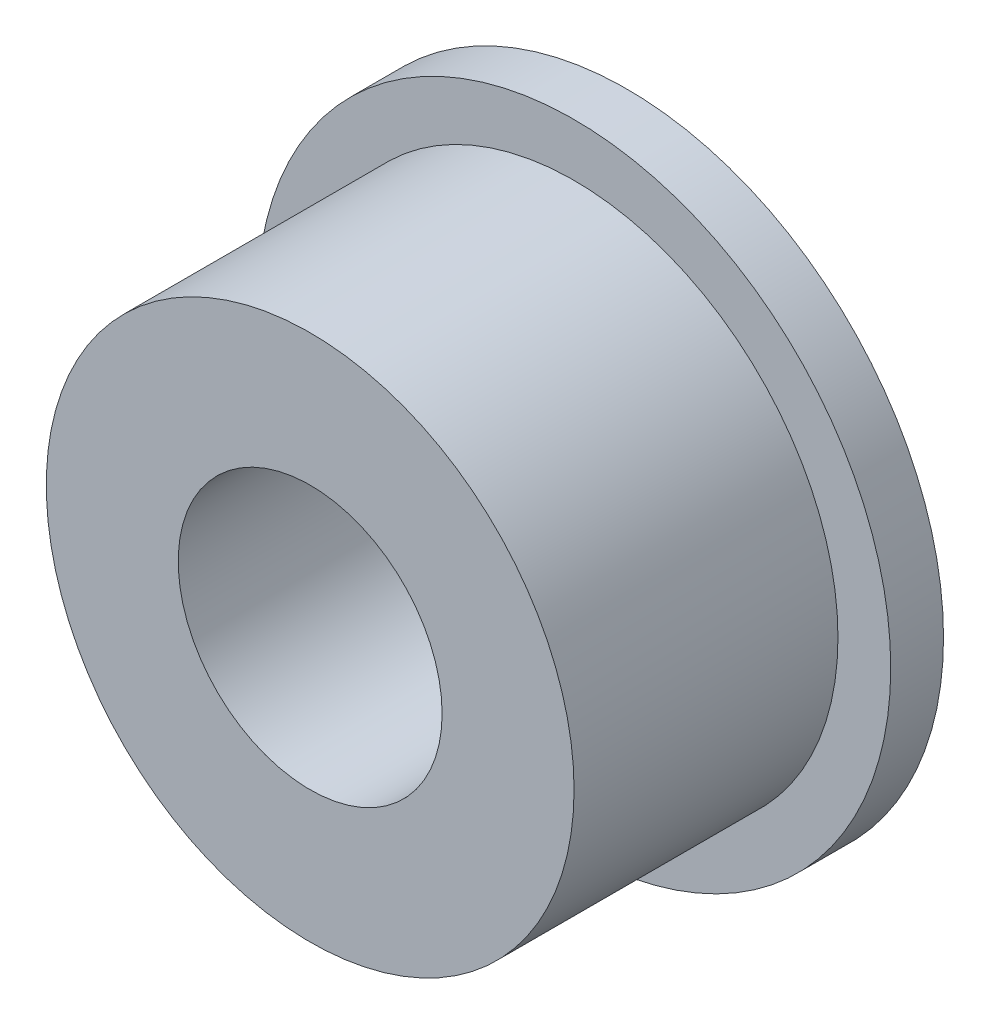
ISO-10303-21;
HEADER;
FILE_DESCRIPTION(('STEP AP214'),'2;1');
FILE_NAME('part.step','',(''),(''),'','','');
FILE_SCHEMA(('AUTOMOTIVE_DESIGN { 1 0 10303 214 1 1 1 1 }'));
ENDSEC;
DATA;
#1=APPLICATION_CONTEXT('core data for automotive mechanical design processes');
#2=APPLICATION_PROTOCOL_DEFINITION('international standard','automotive_design',2000,#1);
#3=PRODUCT_CONTEXT('',#1,'mechanical');
#4=PRODUCT('Part','Part','',(#3));
#5=PRODUCT_RELATED_PRODUCT_CATEGORY('part','',(#4));
#6=PRODUCT_DEFINITION_FORMATION('','',#4);
#7=PRODUCT_DEFINITION_CONTEXT('part definition',#1,'design');
#8=PRODUCT_DEFINITION('design','',#6,#7);
#9=PRODUCT_DEFINITION_SHAPE('','',#8);
#10=(LENGTH_UNIT() NAMED_UNIT(*) SI_UNIT(.MILLI.,.METRE.));
#11=(NAMED_UNIT(*) PLANE_ANGLE_UNIT() SI_UNIT($,.RADIAN.));
#12=(NAMED_UNIT(*) SI_UNIT($,.STERADIAN.) SOLID_ANGLE_UNIT());
#13=UNCERTAINTY_MEASURE_WITH_UNIT(LENGTH_MEASURE(1.E-05),#10,'distance_accuracy_value','');
#14=(GEOMETRIC_REPRESENTATION_CONTEXT(3) GLOBAL_UNCERTAINTY_ASSIGNED_CONTEXT((#13)) GLOBAL_UNIT_ASSIGNED_CONTEXT((#10,
#11,#12)) REPRESENTATION_CONTEXT('',''));
#15=CARTESIAN_POINT('',(0.,0.,0.));
#16=DIRECTION('',(0.,0.,1.));
#17=DIRECTION('',(1.,0.,0.));
#18=AXIS2_PLACEMENT_3D('',#15,#16,#17);
#19=CARTESIAN_POINT('',(2.74953670942324E-13,0.,20.));
#20=DIRECTION('',(0.,0.,1.));
#21=DIRECTION('',(1.,0.,0.));
#22=AXIS2_PLACEMENT_3D('',#19,#20,#21);
#23=CYLINDRICAL_SURFACE('',#22,49.9999999999998);
#24=CARTESIAN_POINT('',(1.37476835471171E-13,0.,10.0000000000007));
#25=DIRECTION('',(0.,0.,1.));
#26=DIRECTION('',(1.,0.,0.));
#27=AXIS2_PLACEMENT_3D('',#24,#25,#26);
#28=CIRCLE('',#27,50.0000000000001);
#29=CARTESIAN_POINT('',(50.0000000000003,0.,10.));
#30=VERTEX_POINT('',#29);
#31=EDGE_CURVE('E10',#30,#30,#28,.T.);
#32=ORIENTED_EDGE('',*,*,#31,.T.);
#33=EDGE_LOOP('',(#32));
#34=FACE_BOUND('',#33,.T.);
#35=CARTESIAN_POINT('',(8.2486101282698E-13,0.,60.0000000000007));
#36=DIRECTION('',(0.,0.,1.));
#37=DIRECTION('',(1.,0.,0.));
#38=AXIS2_PLACEMENT_3D('',#35,#36,#37);
#39=CIRCLE('',#38,49.9999999999995);
#40=CARTESIAN_POINT('',(50.0000000000003,0.,60.));
#41=VERTEX_POINT('',#40);
#42=EDGE_CURVE('E54',#41,#41,#39,.T.);
#43=ORIENTED_EDGE('',*,*,#42,.F.);
#44=EDGE_LOOP('',(#43));
#45=FACE_BOUND('',#44,.T.);
#46=ADVANCED_FACE('F32',(#34,#45),#23,.T.);
#47=CARTESIAN_POINT('',(60.0000000000003,0.,9.99999999999993));
#48=DIRECTION('',(0.,0.,1.));
#49=DIRECTION('',(1.,0.,0.));
#50=AXIS2_PLACEMENT_3D('',#47,#48,#49);
#51=PLANE('',#50);
#52=CARTESIAN_POINT('',(1.37476835471173E-13,0.,10.0000000000008));
#53=DIRECTION('',(0.,0.,1.));
#54=DIRECTION('',(1.,0.,0.));
#55=AXIS2_PLACEMENT_3D('',#52,#53,#54);
#56=CIRCLE('',#55,60.0000000000001);
#57=CARTESIAN_POINT('',(60.0000000000003,0.,10.));
#58=VERTEX_POINT('',#57);
#59=EDGE_CURVE('E38',#58,#58,#56,.T.);
#60=ORIENTED_EDGE('',*,*,#59,.T.);
#61=EDGE_LOOP('',(#60));
#62=FACE_BOUND('',#61,.T.);
#63=ORIENTED_EDGE('',*,*,#31,.F.);
#64=EDGE_LOOP('',(#63));
#65=FACE_BOUND('',#64,.T.);
#66=ADVANCED_FACE('F62',(#62,#65),#51,.T.);
#67=CARTESIAN_POINT('',(2.74953670942324E-13,0.,20.));
#68=DIRECTION('',(0.,0.,1.));
#69=DIRECTION('',(1.,0.,0.));
#70=AXIS2_PLACEMENT_3D('',#67,#68,#69);
#71=CYLINDRICAL_SURFACE('',#70,60.0000000000002);
#72=CARTESIAN_POINT('',(0.,0.,8.2572837456496E-13));
#73=DIRECTION('',(0.,0.,1.));
#74=DIRECTION('',(1.,0.,0.));
#75=AXIS2_PLACEMENT_3D('',#72,#73,#74);
#76=CIRCLE('',#75,60.0000000000003);
#77=CARTESIAN_POINT('',(60.0000000000003,0.,0.));
#78=VERTEX_POINT('',#77);
#79=EDGE_CURVE('E42',#78,#78,#76,.T.);
#80=ORIENTED_EDGE('',*,*,#79,.T.);
#81=EDGE_LOOP('',(#80));
#82=FACE_BOUND('',#81,.T.);
#83=ORIENTED_EDGE('',*,*,#59,.F.);
#84=EDGE_LOOP('',(#83));
#85=FACE_BOUND('',#84,.T.);
#86=ADVANCED_FACE('F66',(#82,#85),#71,.T.);
#87=CARTESIAN_POINT('',(0.,0.,4.12430506413487E-13));
#88=DIRECTION('',(0.,0.,-1.));
#89=DIRECTION('',(-1.,0.,0.));
#90=AXIS2_PLACEMENT_3D('',#87,#88,#89);
#91=PLANE('',#90);
#92=ORIENTED_EDGE('',*,*,#79,.F.);
#93=EDGE_LOOP('',(#92));
#94=FACE_BOUND('',#93,.T.);
#95=ADVANCED_FACE('F70',(#94),#91,.T.);
#96=CARTESIAN_POINT('',(25.0000000000003,0.,19.9999999999997));
#97=DIRECTION('',(0.,0.,1.));
#98=DIRECTION('',(1.,0.,0.));
#99=AXIS2_PLACEMENT_3D('',#96,#97,#98);
#100=PLANE('',#99);
#101=CARTESIAN_POINT('',(2.74953670942324E-13,0.,20.));
#102=DIRECTION('',(0.,0.,1.));
#103=DIRECTION('',(1.,0.,0.));
#104=AXIS2_PLACEMENT_3D('',#101,#102,#103);
#105=CIRCLE('',#104,25.);
#106=CARTESIAN_POINT('',(25.0000000000003,0.,19.9999999999997));
#107=VERTEX_POINT('',#106);
#108=EDGE_CURVE('E46',#107,#107,#105,.T.);
#109=ORIENTED_EDGE('',*,*,#108,.T.);
#110=EDGE_LOOP('',(#109));
#111=FACE_BOUND('',#110,.T.);
#112=ADVANCED_FACE('F77',(#111),#100,.T.);
#113=CARTESIAN_POINT('',(2.74953670942324E-13,0.,20.));
#114=DIRECTION('',(0.,0.,1.));
#115=DIRECTION('',(1.,0.,0.));
#116=AXIS2_PLACEMENT_3D('',#113,#114,#115);
#117=CYLINDRICAL_SURFACE('',#116,24.9999999999997);
#118=CARTESIAN_POINT('',(8.24861012826976E-13,0.,60.0000000000003));
#119=DIRECTION('',(0.,0.,1.));
#120=DIRECTION('',(1.,0.,0.));
#121=AXIS2_PLACEMENT_3D('',#118,#119,#120);
#122=CIRCLE('',#121,24.9999999999995);
#123=CARTESIAN_POINT('',(25.0000000000003,0.,60.));
#124=VERTEX_POINT('',#123);
#125=EDGE_CURVE('E51',#124,#124,#122,.T.);
#126=ORIENTED_EDGE('',*,*,#125,.T.);
#127=EDGE_LOOP('',(#126));
#128=FACE_BOUND('',#127,.T.);
#129=ORIENTED_EDGE('',*,*,#108,.F.);
#130=EDGE_LOOP('',(#129));
#131=FACE_BOUND('',#130,.T.);
#132=ADVANCED_FACE('F81',(#128,#131),#117,.F.);
#133=CARTESIAN_POINT('',(25.0000000000003,0.,60.0000000000002));
#134=DIRECTION('',(0.,0.,1.));
#135=DIRECTION('',(1.,0.,0.));
#136=AXIS2_PLACEMENT_3D('',#133,#134,#135);
#137=PLANE('',#136);
#138=ORIENTED_EDGE('',*,*,#42,.T.);
#139=EDGE_LOOP('',(#138));
#140=FACE_BOUND('',#139,.T.);
#141=ORIENTED_EDGE('',*,*,#125,.F.);
#142=EDGE_LOOP('',(#141));
#143=FACE_BOUND('',#142,.T.);
#144=ADVANCED_FACE('F58',(#140,#143),#137,.T.);
#145=CLOSED_SHELL('',(#46,#66,#86,#95,#112,#132,#144));
#146=MANIFOLD_SOLID_BREP('B2',#145);
#147=ADVANCED_BREP_SHAPE_REPRESENTATION('',(#18,#146),#14);
#148=SHAPE_DEFINITION_REPRESENTATION(#9,#147);
ENDSEC;
END-ISO-10303-21;
